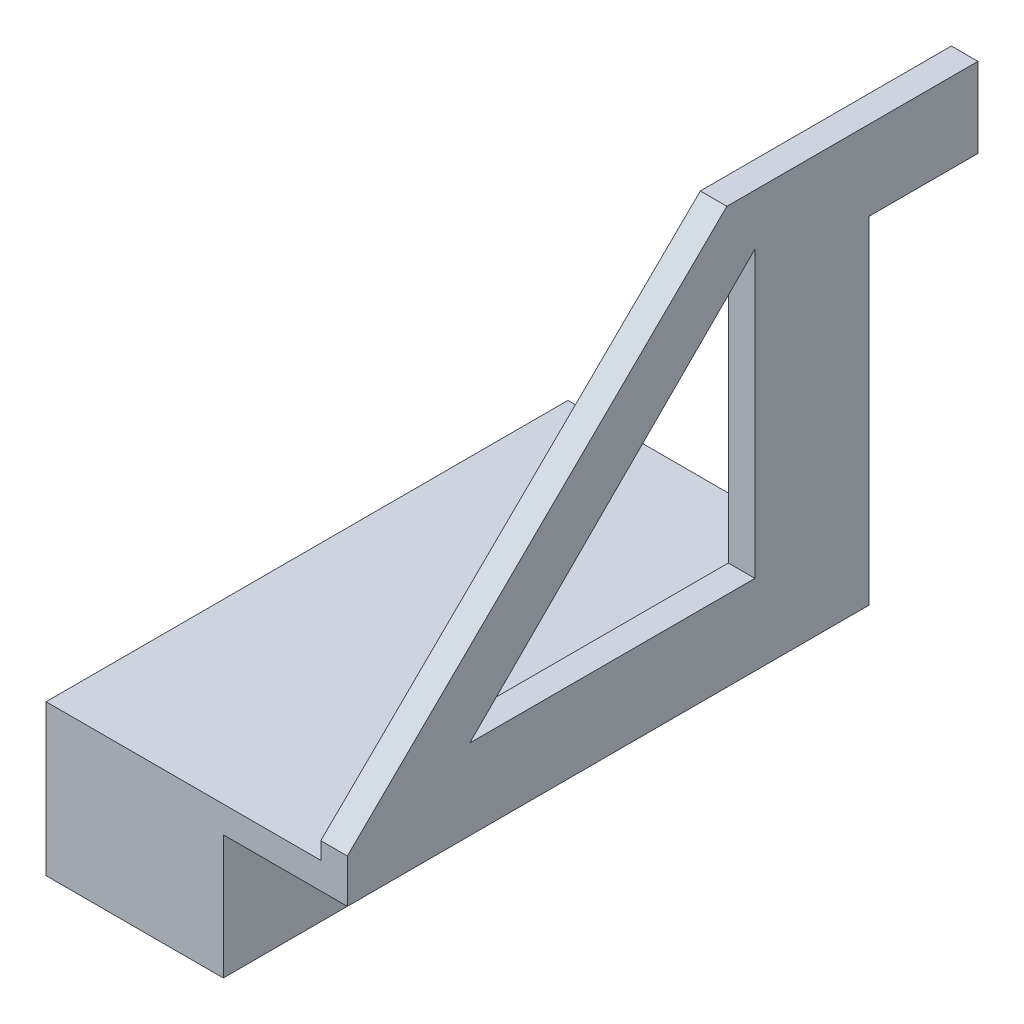
ISO-10303-21;
HEADER;
FILE_DESCRIPTION(('STEP AP214'),'2;1');
FILE_NAME('part.step','',(''),(''),'','','');
FILE_SCHEMA(('AUTOMOTIVE_DESIGN { 1 0 10303 214 1 1 1 1 }'));
ENDSEC;
DATA;
#1=APPLICATION_CONTEXT('core data for automotive mechanical design processes');
#2=APPLICATION_PROTOCOL_DEFINITION('international standard','automotive_design',2000,#1);
#3=PRODUCT_CONTEXT('',#1,'mechanical');
#4=PRODUCT('Part','Part','',(#3));
#5=PRODUCT_RELATED_PRODUCT_CATEGORY('part','',(#4));
#6=PRODUCT_DEFINITION_FORMATION('','',#4);
#7=PRODUCT_DEFINITION_CONTEXT('part definition',#1,'design');
#8=PRODUCT_DEFINITION('design','',#6,#7);
#9=PRODUCT_DEFINITION_SHAPE('','',#8);
#10=(LENGTH_UNIT() NAMED_UNIT(*) SI_UNIT(.MILLI.,.METRE.));
#11=(NAMED_UNIT(*) PLANE_ANGLE_UNIT() SI_UNIT($,.RADIAN.));
#12=(NAMED_UNIT(*) SI_UNIT($,.STERADIAN.) SOLID_ANGLE_UNIT());
#13=UNCERTAINTY_MEASURE_WITH_UNIT(LENGTH_MEASURE(1.E-05),#10,'distance_accuracy_value','');
#14=(GEOMETRIC_REPRESENTATION_CONTEXT(3) GLOBAL_UNCERTAINTY_ASSIGNED_CONTEXT((#13)) GLOBAL_UNIT_ASSIGNED_CONTEXT((#10,
#11,#12)) REPRESENTATION_CONTEXT('',''));
#15=CARTESIAN_POINT('',(0.,0.,0.));
#16=DIRECTION('',(0.,0.,1.));
#17=DIRECTION('',(1.,0.,0.));
#18=AXIS2_PLACEMENT_3D('',#15,#16,#17);
#19=CARTESIAN_POINT('',(0.,1.5,0.));
#20=DIRECTION('',(0.,-1.,0.));
#21=DIRECTION('',(0.,0.,-1.));
#22=AXIS2_PLACEMENT_3D('',#19,#20,#21);
#23=PLANE('',#22);
#24=DIRECTION('',(0.,0.,1.));
#25=VECTOR('',#24,1.);
#26=CARTESIAN_POINT('',(15.5,1.5,0.));
#27=LINE('',#26,#25);
#28=CARTESIAN_POINT('',(15.5,1.5,-29.4448167253925));
#29=VERTEX_POINT('',#28);
#30=CARTESIAN_POINT('',(15.5,1.5,0.));
#31=VERTEX_POINT('',#30);
#32=EDGE_CURVE('E205',#29,#31,#27,.T.);
#33=ORIENTED_EDGE('',*,*,#32,.F.);
#34=DIRECTION('',(-1.,0.,0.));
#35=VECTOR('',#34,1.);
#36=CARTESIAN_POINT('',(0.,1.5,-29.4448167253925));
#37=LINE('',#36,#35);
#38=CARTESIAN_POINT('',(0.,1.50000000000001,-29.4448167253925));
#39=VERTEX_POINT('',#38);
#40=EDGE_CURVE('E159',#29,#39,#37,.T.);
#41=ORIENTED_EDGE('',*,*,#40,.T.);
#42=DIRECTION('',(0.,0.,1.));
#43=VECTOR('',#42,1.);
#44=CARTESIAN_POINT('',(0.,1.5,0.));
#45=LINE('',#44,#43);
#46=CARTESIAN_POINT('',(0.,1.5,0.));
#47=VERTEX_POINT('',#46);
#48=EDGE_CURVE('E229',#39,#47,#45,.T.);
#49=ORIENTED_EDGE('',*,*,#48,.T.);
#50=DIRECTION('',(1.,0.,0.));
#51=VECTOR('',#50,1.);
#52=CARTESIAN_POINT('',(0.,1.5,0.));
#53=LINE('',#52,#51);
#54=EDGE_CURVE('E231',#47,#31,#53,.T.);
#55=ORIENTED_EDGE('',*,*,#54,.T.);
#56=EDGE_LOOP('',(#33,#41,#49,#55));
#57=FACE_BOUND('',#56,.T.);
#58=ADVANCED_FACE('F33',(#57),#23,.F.);
#59=CARTESIAN_POINT('',(0.,1.5,0.));
#60=DIRECTION('',(1.,0.,0.));
#61=DIRECTION('',(0.,0.,-1.));
#62=AXIS2_PLACEMENT_3D('',#59,#60,#61);
#63=PLANE('',#62);
#64=ORIENTED_EDGE('',*,*,#48,.F.);
#65=DIRECTION('',(0.,-1.,0.));
#66=VECTOR('',#65,1.);
#67=CARTESIAN_POINT('',(0.,19.,-29.4448167253925));
#68=LINE('',#67,#66);
#69=CARTESIAN_POINT('',(0.,-7.,-29.4448167253925));
#70=VERTEX_POINT('',#69);
#71=EDGE_CURVE('E152',#39,#70,#68,.T.);
#72=ORIENTED_EDGE('',*,*,#71,.T.);
#73=DIRECTION('',(0.,0.,-1.));
#74=VECTOR('',#73,1.);
#75=CARTESIAN_POINT('',(0.,-7.,0.));
#76=LINE('',#75,#74);
#77=CARTESIAN_POINT('',(0.,-7.,0.));
#78=VERTEX_POINT('',#77);
#79=EDGE_CURVE('E216',#78,#70,#76,.T.);
#80=ORIENTED_EDGE('',*,*,#79,.F.);
#81=DIRECTION('',(0.,-1.,0.));
#82=VECTOR('',#81,1.);
#83=CARTESIAN_POINT('',(0.,1.5,0.));
#84=LINE('',#83,#82);
#85=EDGE_CURVE('E207',#47,#78,#84,.T.);
#86=ORIENTED_EDGE('',*,*,#85,.F.);
#87=EDGE_LOOP('',(#64,#72,#80,#86));
#88=FACE_BOUND('',#87,.T.);
#89=ADVANCED_FACE('F35',(#88),#63,.F.);
#90=CARTESIAN_POINT('',(0.,1.5,0.));
#91=DIRECTION('',(0.,0.,-1.));
#92=DIRECTION('',(-1.,0.,0.));
#93=AXIS2_PLACEMENT_3D('',#90,#91,#92);
#94=PLANE('',#93);
#95=DIRECTION('',(0.,-1.,0.));
#96=VECTOR('',#95,1.);
#97=CARTESIAN_POINT('',(17.,1.5,0.));
#98=LINE('',#97,#96);
#99=CARTESIAN_POINT('',(17.,2.4604979232663,0.));
#100=VERTEX_POINT('',#99);
#101=CARTESIAN_POINT('',(17.,0.,0.));
#102=VERTEX_POINT('',#101);
#103=EDGE_CURVE('E234',#100,#102,#98,.T.);
#104=ORIENTED_EDGE('',*,*,#103,.F.);
#105=DIRECTION('',(1.,0.,0.));
#106=VECTOR('',#105,1.);
#107=CARTESIAN_POINT('',(-0.001000000000001,2.4604979232663,0.));
#108=LINE('',#107,#106);
#109=CARTESIAN_POINT('',(15.5,2.4604979232663,0.));
#110=VERTEX_POINT('',#109);
#111=EDGE_CURVE('E192',#110,#100,#108,.T.);
#112=ORIENTED_EDGE('',*,*,#111,.F.);
#113=DIRECTION('',(0.,-1.,0.));
#114=VECTOR('',#113,1.);
#115=CARTESIAN_POINT('',(15.5,23.5,0.));
#116=LINE('',#115,#114);
#117=EDGE_CURVE('E204',#110,#31,#116,.T.);
#118=ORIENTED_EDGE('',*,*,#117,.T.);
#119=ORIENTED_EDGE('',*,*,#54,.F.);
#120=ORIENTED_EDGE('',*,*,#85,.T.);
#121=DIRECTION('',(-1.,0.,0.));
#122=VECTOR('',#121,1.);
#123=CARTESIAN_POINT('',(0.,-7.,0.));
#124=LINE('',#123,#122);
#125=CARTESIAN_POINT('',(10.,-7.,0.));
#126=VERTEX_POINT('',#125);
#127=EDGE_CURVE('E221',#126,#78,#124,.T.);
#128=ORIENTED_EDGE('',*,*,#127,.F.);
#129=DIRECTION('',(0.,1.,0.));
#130=VECTOR('',#129,1.);
#131=CARTESIAN_POINT('',(10.,-7.,0.));
#132=LINE('',#131,#130);
#133=CARTESIAN_POINT('',(10.,0.,0.));
#134=VERTEX_POINT('',#133);
#135=EDGE_CURVE('E224',#126,#134,#132,.T.);
#136=ORIENTED_EDGE('',*,*,#135,.T.);
#137=DIRECTION('',(1.,0.,0.));
#138=VECTOR('',#137,1.);
#139=CARTESIAN_POINT('',(0.,0.,0.));
#140=LINE('',#139,#138);
#141=EDGE_CURVE('E228',#134,#102,#140,.T.);
#142=ORIENTED_EDGE('',*,*,#141,.T.);
#143=EDGE_LOOP('',(#104,#112,#118,#119,#120,#128,#136,#142));
#144=FACE_BOUND('',#143,.T.);
#145=ADVANCED_FACE('F259',(#144),#94,.F.);
#146=CARTESIAN_POINT('',(17.,1.5,0.));
#147=DIRECTION('',(-1.,0.,0.));
#148=DIRECTION('',(0.,0.,1.));
#149=AXIS2_PLACEMENT_3D('',#146,#147,#148);
#150=PLANE('',#149);
#151=DIRECTION('',(0.,-0.707106781186554,0.707106781186541));
#152=VECTOR('',#151,1.);
#153=CARTESIAN_POINT('',(17.,20.6182654030778,-22.9946807849213));
#154=LINE('',#153,#152);
#155=CARTESIAN_POINT('',(17.,20.6182654030778,-22.9946807849213));
#156=VERTEX_POINT('',#155);
#157=CARTESIAN_POINT('',(17.,4.52903879822654,-6.90545418007034));
#158=VERTEX_POINT('',#157);
#159=EDGE_CURVE('E173',#156,#158,#154,.T.);
#160=ORIENTED_EDGE('',*,*,#159,.F.);
#161=DIRECTION('',(0.,1.,0.));
#162=VECTOR('',#161,1.);
#163=CARTESIAN_POINT('',(17.,20.6182654030778,-22.9946807849213));
#164=LINE('',#163,#162);
#165=CARTESIAN_POINT('',(17.,4.52903879822654,-22.9946807849213));
#166=VERTEX_POINT('',#165);
#167=EDGE_CURVE('E56',#166,#156,#164,.T.);
#168=ORIENTED_EDGE('',*,*,#167,.F.);
#169=DIRECTION('',(0.,0.,-1.));
#170=VECTOR('',#169,1.);
#171=CARTESIAN_POINT('',(17.,4.52903879822654,-6.90545418007034));
#172=LINE('',#171,#170);
#173=EDGE_CURVE('E176',#158,#166,#172,.T.);
#174=ORIENTED_EDGE('',*,*,#173,.F.);
#175=EDGE_LOOP('',(#160,#168,#174));
#176=FACE_BOUND('',#175,.T.);
#177=DIRECTION('',(0.,0.,-1.));
#178=VECTOR('',#177,1.);
#179=CARTESIAN_POINT('',(17.,0.,0.));
#180=LINE('',#179,#178);
#181=CARTESIAN_POINT('',(17.,0.,-29.4448167253925));
#182=VERTEX_POINT('',#181);
#183=EDGE_CURVE('E151',#102,#182,#180,.T.);
#184=ORIENTED_EDGE('',*,*,#183,.T.);
#185=DIRECTION('',(0.,-1.,0.));
#186=VECTOR('',#185,1.);
#187=CARTESIAN_POINT('',(17.,19.,-29.4448167253925));
#188=LINE('',#187,#186);
#189=CARTESIAN_POINT('',(17.,19.,-29.4448167253925));
#190=VERTEX_POINT('',#189);
#191=EDGE_CURVE('E144',#190,#182,#188,.T.);
#192=ORIENTED_EDGE('',*,*,#191,.F.);
#193=DIRECTION('',(0.,0.,1.));
#194=VECTOR('',#193,1.);
#195=CARTESIAN_POINT('',(17.,19.,-36.2916906559123));
#196=LINE('',#195,#194);
#197=CARTESIAN_POINT('',(17.,19.,-35.5776579254439));
#198=VERTEX_POINT('',#197);
#199=EDGE_CURVE('E132',#198,#190,#196,.T.);
#200=ORIENTED_EDGE('',*,*,#199,.F.);
#201=DIRECTION('',(0.,-1.,0.));
#202=VECTOR('',#201,1.);
#203=CARTESIAN_POINT('',(17.,23.5,-35.5776579254439));
#204=LINE('',#203,#202);
#205=CARTESIAN_POINT('',(17.,23.5,-35.5776579254439));
#206=VERTEX_POINT('',#205);
#207=EDGE_CURVE('E213',#206,#198,#204,.T.);
#208=ORIENTED_EDGE('',*,*,#207,.F.);
#209=DIRECTION('',(0.,0.,-1.));
#210=VECTOR('',#209,1.);
#211=CARTESIAN_POINT('',(17.,23.5,0.));
#212=LINE('',#211,#210);
#213=CARTESIAN_POINT('',(17.,23.5,-21.4133338682245));
#214=VERTEX_POINT('',#213);
#215=EDGE_CURVE('E196',#214,#206,#212,.T.);
#216=ORIENTED_EDGE('',*,*,#215,.F.);
#217=DIRECTION('',(0.,0.700852957782046,-0.713305777046673));
#218=VECTOR('',#217,1.);
#219=CARTESIAN_POINT('',(17.,2.4604979232663,0.));
#220=LINE('',#219,#218);
#221=EDGE_CURVE('E190',#100,#214,#220,.T.);
#222=ORIENTED_EDGE('',*,*,#221,.F.);
#223=ORIENTED_EDGE('',*,*,#103,.T.);
#224=EDGE_LOOP('',(#184,#192,#200,#208,#216,#222,#223));
#225=FACE_BOUND('',#224,.T.);
#226=ADVANCED_FACE('F149',(#176,#225),#150,.F.);
#227=CARTESIAN_POINT('',(0.,0.,0.));
#228=DIRECTION('',(0.,-1.,0.));
#229=DIRECTION('',(0.,0.,-1.));
#230=AXIS2_PLACEMENT_3D('',#227,#228,#229);
#231=PLANE('',#230);
#232=DIRECTION('',(-1.,0.,0.));
#233=VECTOR('',#232,1.);
#234=CARTESIAN_POINT('',(0.,0.,-29.4448167253925));
#235=LINE('',#234,#233);
#236=CARTESIAN_POINT('',(10.,0.,-29.4448167253925));
#237=VERTEX_POINT('',#236);
#238=EDGE_CURVE('E165',#182,#237,#235,.T.);
#239=ORIENTED_EDGE('',*,*,#238,.F.);
#240=ORIENTED_EDGE('',*,*,#183,.F.);
#241=ORIENTED_EDGE('',*,*,#141,.F.);
#242=DIRECTION('',(0.,0.,1.));
#243=VECTOR('',#242,1.);
#244=CARTESIAN_POINT('',(10.,0.,0.));
#245=LINE('',#244,#243);
#246=EDGE_CURVE('E215',#237,#134,#245,.T.);
#247=ORIENTED_EDGE('',*,*,#246,.F.);
#248=EDGE_LOOP('',(#239,#240,#241,#247));
#249=FACE_BOUND('',#248,.T.);
#250=ADVANCED_FACE('F276',(#249),#231,.T.);
#251=CARTESIAN_POINT('',(10.,-7.,0.));
#252=DIRECTION('',(-1.,0.,0.));
#253=DIRECTION('',(0.,0.,1.));
#254=AXIS2_PLACEMENT_3D('',#251,#252,#253);
#255=PLANE('',#254);
#256=DIRECTION('',(0.,0.,1.));
#257=VECTOR('',#256,1.);
#258=CARTESIAN_POINT('',(10.,-7.,0.));
#259=LINE('',#258,#257);
#260=CARTESIAN_POINT('',(10.,-7.,-29.4448167253925));
#261=VERTEX_POINT('',#260);
#262=EDGE_CURVE('E219',#261,#126,#259,.T.);
#263=ORIENTED_EDGE('',*,*,#262,.F.);
#264=DIRECTION('',(0.,1.,0.));
#265=VECTOR('',#264,1.);
#266=CARTESIAN_POINT('',(10.,-7.,-29.4448167253925));
#267=LINE('',#266,#265);
#268=EDGE_CURVE('E162',#261,#237,#267,.T.);
#269=ORIENTED_EDGE('',*,*,#268,.T.);
#270=ORIENTED_EDGE('',*,*,#246,.T.);
#271=ORIENTED_EDGE('',*,*,#135,.F.);
#272=EDGE_LOOP('',(#263,#269,#270,#271));
#273=FACE_BOUND('',#272,.T.);
#274=ADVANCED_FACE('F272',(#273),#255,.F.);
#275=CARTESIAN_POINT('',(0.,-7.,0.));
#276=DIRECTION('',(0.,-1.,0.));
#277=DIRECTION('',(0.,0.,-1.));
#278=AXIS2_PLACEMENT_3D('',#275,#276,#277);
#279=PLANE('',#278);
#280=DIRECTION('',(-1.,0.,0.));
#281=VECTOR('',#280,1.);
#282=CARTESIAN_POINT('',(0.,-7.,-29.4448167253925));
#283=LINE('',#282,#281);
#284=EDGE_CURVE('E140',#261,#70,#283,.T.);
#285=ORIENTED_EDGE('',*,*,#284,.F.);
#286=ORIENTED_EDGE('',*,*,#262,.T.);
#287=ORIENTED_EDGE('',*,*,#127,.T.);
#288=ORIENTED_EDGE('',*,*,#79,.T.);
#289=EDGE_LOOP('',(#285,#286,#287,#288));
#290=FACE_BOUND('',#289,.T.);
#291=ADVANCED_FACE('F268',(#290),#279,.T.);
#292=CARTESIAN_POINT('',(17.,23.5,-35.5776579254439));
#293=DIRECTION('',(0.,0.,1.));
#294=DIRECTION('',(1.,0.,0.));
#295=AXIS2_PLACEMENT_3D('',#292,#293,#294);
#296=PLANE('',#295);
#297=ORIENTED_EDGE('',*,*,#207,.T.);
#298=DIRECTION('',(-1.,0.,0.));
#299=VECTOR('',#298,1.);
#300=CARTESIAN_POINT('',(17.,19.,-35.5776579254439));
#301=LINE('',#300,#299);
#302=CARTESIAN_POINT('',(15.5,19.,-35.5776579254439));
#303=VERTEX_POINT('',#302);
#304=EDGE_CURVE('E135',#198,#303,#301,.T.);
#305=ORIENTED_EDGE('',*,*,#304,.T.);
#306=DIRECTION('',(0.,-1.,0.));
#307=VECTOR('',#306,1.);
#308=CARTESIAN_POINT('',(15.5,23.5,-35.5776579254439));
#309=LINE('',#308,#307);
#310=CARTESIAN_POINT('',(15.5,23.5,-35.5776579254439));
#311=VERTEX_POINT('',#310);
#312=EDGE_CURVE('E210',#311,#303,#309,.T.);
#313=ORIENTED_EDGE('',*,*,#312,.F.);
#314=DIRECTION('',(-1.,0.,0.));
#315=VECTOR('',#314,1.);
#316=CARTESIAN_POINT('',(17.,23.5,-35.5776579254439));
#317=LINE('',#316,#315);
#318=EDGE_CURVE('E199',#206,#311,#317,.T.);
#319=ORIENTED_EDGE('',*,*,#318,.F.);
#320=EDGE_LOOP('',(#297,#305,#313,#319));
#321=FACE_BOUND('',#320,.T.);
#322=ADVANCED_FACE('F245',(#321),#296,.F.);
#323=CARTESIAN_POINT('',(15.5,23.5,0.));
#324=DIRECTION('',(1.,0.,0.));
#325=DIRECTION('',(0.,0.,-1.));
#326=AXIS2_PLACEMENT_3D('',#323,#324,#325);
#327=PLANE('',#326);
#328=DIRECTION('',(0.,0.,1.));
#329=VECTOR('',#328,1.);
#330=CARTESIAN_POINT('',(15.5,4.52903879822654,-6.90545418007034));
#331=LINE('',#330,#329);
#332=CARTESIAN_POINT('',(15.5,4.52903879822654,-22.9946807849213));
#333=VERTEX_POINT('',#332);
#334=CARTESIAN_POINT('',(15.5,4.52903879822654,-6.90545418007035));
#335=VERTEX_POINT('',#334);
#336=EDGE_CURVE('E167',#333,#335,#331,.T.);
#337=ORIENTED_EDGE('',*,*,#336,.F.);
#338=DIRECTION('',(0.,-1.,0.));
#339=VECTOR('',#338,1.);
#340=CARTESIAN_POINT('',(15.5,20.6182654030778,-22.9946807849213));
#341=LINE('',#340,#339);
#342=CARTESIAN_POINT('',(15.5,20.6182654030778,-22.9946807849213));
#343=VERTEX_POINT('',#342);
#344=EDGE_CURVE('E169',#343,#333,#341,.T.);
#345=ORIENTED_EDGE('',*,*,#344,.F.);
#346=DIRECTION('',(0.,0.707106781186554,-0.707106781186541));
#347=VECTOR('',#346,1.);
#348=CARTESIAN_POINT('',(15.5,20.6182654030778,-22.9946807849213));
#349=LINE('',#348,#347);
#350=EDGE_CURVE('E182',#335,#343,#349,.T.);
#351=ORIENTED_EDGE('',*,*,#350,.F.);
#352=EDGE_LOOP('',(#337,#345,#351));
#353=FACE_BOUND('',#352,.T.);
#354=DIRECTION('',(0.,0.,1.));
#355=VECTOR('',#354,1.);
#356=CARTESIAN_POINT('',(15.5,19.,0.));
#357=LINE('',#356,#355);
#358=CARTESIAN_POINT('',(15.5,19.,-29.4448167253925));
#359=VERTEX_POINT('',#358);
#360=EDGE_CURVE('E41',#303,#359,#357,.T.);
#361=ORIENTED_EDGE('',*,*,#360,.T.);
#362=DIRECTION('',(0.,-1.,0.));
#363=VECTOR('',#362,1.);
#364=CARTESIAN_POINT('',(15.5,23.5,-29.4448167253925));
#365=LINE('',#364,#363);
#366=EDGE_CURVE('E11',#359,#29,#365,.T.);
#367=ORIENTED_EDGE('',*,*,#366,.T.);
#368=ORIENTED_EDGE('',*,*,#32,.T.);
#369=ORIENTED_EDGE('',*,*,#117,.F.);
#370=DIRECTION('',(0.,-0.700852957782046,0.713305777046673));
#371=VECTOR('',#370,1.);
#372=CARTESIAN_POINT('',(15.5,2.4604979232663,0.));
#373=LINE('',#372,#371);
#374=CARTESIAN_POINT('',(15.5,23.5,-21.4133338682245));
#375=VERTEX_POINT('',#374);
#376=EDGE_CURVE('E188',#375,#110,#373,.T.);
#377=ORIENTED_EDGE('',*,*,#376,.F.);
#378=DIRECTION('',(0.,0.,1.));
#379=VECTOR('',#378,1.);
#380=CARTESIAN_POINT('',(15.5,23.5,0.));
#381=LINE('',#380,#379);
#382=EDGE_CURVE('E201',#311,#375,#381,.T.);
#383=ORIENTED_EDGE('',*,*,#382,.F.);
#384=ORIENTED_EDGE('',*,*,#312,.T.);
#385=EDGE_LOOP('',(#361,#367,#368,#369,#377,#383,#384));
#386=FACE_BOUND('',#385,.T.);
#387=ADVANCED_FACE('F240',(#353,#386),#327,.F.);
#388=CARTESIAN_POINT('',(0.,23.5,0.));
#389=DIRECTION('',(0.,1.,0.));
#390=DIRECTION('',(0.,0.,1.));
#391=AXIS2_PLACEMENT_3D('',#388,#389,#390);
#392=PLANE('',#391);
#393=DIRECTION('',(1.,0.,0.));
#394=VECTOR('',#393,1.);
#395=CARTESIAN_POINT('',(-0.001000000000001,23.5,-21.4133338682245));
#396=LINE('',#395,#394);
#397=EDGE_CURVE('E193',#375,#214,#396,.T.);
#398=ORIENTED_EDGE('',*,*,#397,.T.);
#399=ORIENTED_EDGE('',*,*,#215,.T.);
#400=ORIENTED_EDGE('',*,*,#318,.T.);
#401=ORIENTED_EDGE('',*,*,#382,.T.);
#402=EDGE_LOOP('',(#398,#399,#400,#401));
#403=FACE_BOUND('',#402,.T.);
#404=ADVANCED_FACE('F251',(#403),#392,.T.);
#405=CARTESIAN_POINT('',(-0.001000000000001,2.4604979232663,0.));
#406=DIRECTION('',(0.,-0.713305777046673,-0.700852957782046));
#407=DIRECTION('',(0.,0.700852957782046,-0.713305777046673));
#408=AXIS2_PLACEMENT_3D('',#405,#406,#407);
#409=PLANE('',#408);
#410=ORIENTED_EDGE('',*,*,#376,.T.);
#411=ORIENTED_EDGE('',*,*,#111,.T.);
#412=ORIENTED_EDGE('',*,*,#221,.T.);
#413=ORIENTED_EDGE('',*,*,#397,.F.);
#414=EDGE_LOOP('',(#410,#411,#412,#413));
#415=FACE_BOUND('',#414,.T.);
#416=ADVANCED_FACE('F254',(#415),#409,.F.);
#417=CARTESIAN_POINT('',(-0.001000000000001,20.6182654030778,-22.9946807849213));
#418=DIRECTION('',(0.,0.,-1.));
#419=DIRECTION('',(-1.,0.,0.));
#420=AXIS2_PLACEMENT_3D('',#417,#418,#419);
#421=PLANE('',#420);
#422=ORIENTED_EDGE('',*,*,#344,.T.);
#423=DIRECTION('',(1.,0.,0.));
#424=VECTOR('',#423,1.);
#425=CARTESIAN_POINT('',(-0.001000000000001,4.52903879822654,-22.9946807849213));
#426=LINE('',#425,#424);
#427=EDGE_CURVE('E180',#333,#166,#426,.T.);
#428=ORIENTED_EDGE('',*,*,#427,.T.);
#429=ORIENTED_EDGE('',*,*,#167,.T.);
#430=DIRECTION('',(1.,0.,0.));
#431=VECTOR('',#430,1.);
#432=CARTESIAN_POINT('',(-0.001000000000001,20.6182654030778,-22.9946807849213));
#433=LINE('',#432,#431);
#434=EDGE_CURVE('E179',#343,#156,#433,.T.);
#435=ORIENTED_EDGE('',*,*,#434,.F.);
#436=EDGE_LOOP('',(#422,#428,#429,#435));
#437=FACE_BOUND('',#436,.T.);
#438=ADVANCED_FACE('F303',(#437),#421,.F.);
#439=CARTESIAN_POINT('',(-0.001000000000001,4.52903879822654,-6.90545418007034));
#440=DIRECTION('',(0.,-1.,0.));
#441=DIRECTION('',(0.,0.,-1.));
#442=AXIS2_PLACEMENT_3D('',#439,#440,#441);
#443=PLANE('',#442);
#444=ORIENTED_EDGE('',*,*,#336,.T.);
#445=DIRECTION('',(1.,0.,0.));
#446=VECTOR('',#445,1.);
#447=CARTESIAN_POINT('',(-0.001000000000001,4.52903879822654,-6.90545418007034));
#448=LINE('',#447,#446);
#449=EDGE_CURVE('E183',#335,#158,#448,.T.);
#450=ORIENTED_EDGE('',*,*,#449,.T.);
#451=ORIENTED_EDGE('',*,*,#173,.T.);
#452=ORIENTED_EDGE('',*,*,#427,.F.);
#453=EDGE_LOOP('',(#444,#450,#451,#452));
#454=FACE_BOUND('',#453,.T.);
#455=ADVANCED_FACE('F306',(#454),#443,.F.);
#456=CARTESIAN_POINT('',(-0.001000000000001,20.6182654030778,-22.9946807849213));
#457=DIRECTION('',(0.,0.707106781186541,0.707106781186554));
#458=DIRECTION('',(0.,-0.707106781186554,0.707106781186541));
#459=AXIS2_PLACEMENT_3D('',#456,#457,#458);
#460=PLANE('',#459);
#461=ORIENTED_EDGE('',*,*,#350,.T.);
#462=ORIENTED_EDGE('',*,*,#434,.T.);
#463=ORIENTED_EDGE('',*,*,#159,.T.);
#464=ORIENTED_EDGE('',*,*,#449,.F.);
#465=EDGE_LOOP('',(#461,#462,#463,#464));
#466=FACE_BOUND('',#465,.T.);
#467=ADVANCED_FACE('F307',(#466),#460,.F.);
#468=CARTESIAN_POINT('',(0.,19.,-29.4448167253925));
#469=DIRECTION('',(0.,0.,1.));
#470=DIRECTION('',(1.,0.,0.));
#471=AXIS2_PLACEMENT_3D('',#468,#469,#470);
#472=PLANE('',#471);
#473=ORIENTED_EDGE('',*,*,#238,.T.);
#474=ORIENTED_EDGE('',*,*,#268,.F.);
#475=ORIENTED_EDGE('',*,*,#284,.T.);
#476=ORIENTED_EDGE('',*,*,#71,.F.);
#477=ORIENTED_EDGE('',*,*,#40,.F.);
#478=ORIENTED_EDGE('',*,*,#366,.F.);
#479=DIRECTION('',(-1.,0.,0.));
#480=VECTOR('',#479,1.);
#481=CARTESIAN_POINT('',(0.,19.,-29.4448167253925));
#482=LINE('',#481,#480);
#483=EDGE_CURVE('E48',#190,#359,#482,.T.);
#484=ORIENTED_EDGE('',*,*,#483,.F.);
#485=ORIENTED_EDGE('',*,*,#191,.T.);
#486=EDGE_LOOP('',(#473,#474,#475,#476,#477,#478,#484,#485));
#487=FACE_BOUND('',#486,.T.);
#488=ADVANCED_FACE('F143',(#487),#472,.F.);
#489=CARTESIAN_POINT('',(0.,19.,0.));
#490=DIRECTION('',(0.,1.,0.));
#491=DIRECTION('',(0.,0.,1.));
#492=AXIS2_PLACEMENT_3D('',#489,#490,#491);
#493=PLANE('',#492);
#494=ORIENTED_EDGE('',*,*,#199,.T.);
#495=ORIENTED_EDGE('',*,*,#483,.T.);
#496=ORIENTED_EDGE('',*,*,#360,.F.);
#497=ORIENTED_EDGE('',*,*,#304,.F.);
#498=EDGE_LOOP('',(#494,#495,#496,#497));
#499=FACE_BOUND('',#498,.T.);
#500=ADVANCED_FACE('F133',(#499),#493,.F.);
#501=CLOSED_SHELL('',(#58,#89,#145,#226,#250,#274,#291,#322,#387,#404,#416,#438,#455,#467,#488,#500));
#502=MANIFOLD_SOLID_BREP('B2',#501);
#503=ADVANCED_BREP_SHAPE_REPRESENTATION('',(#18,#502),#14);
#504=SHAPE_DEFINITION_REPRESENTATION(#9,#503);
ENDSEC;
END-ISO-10303-21;
